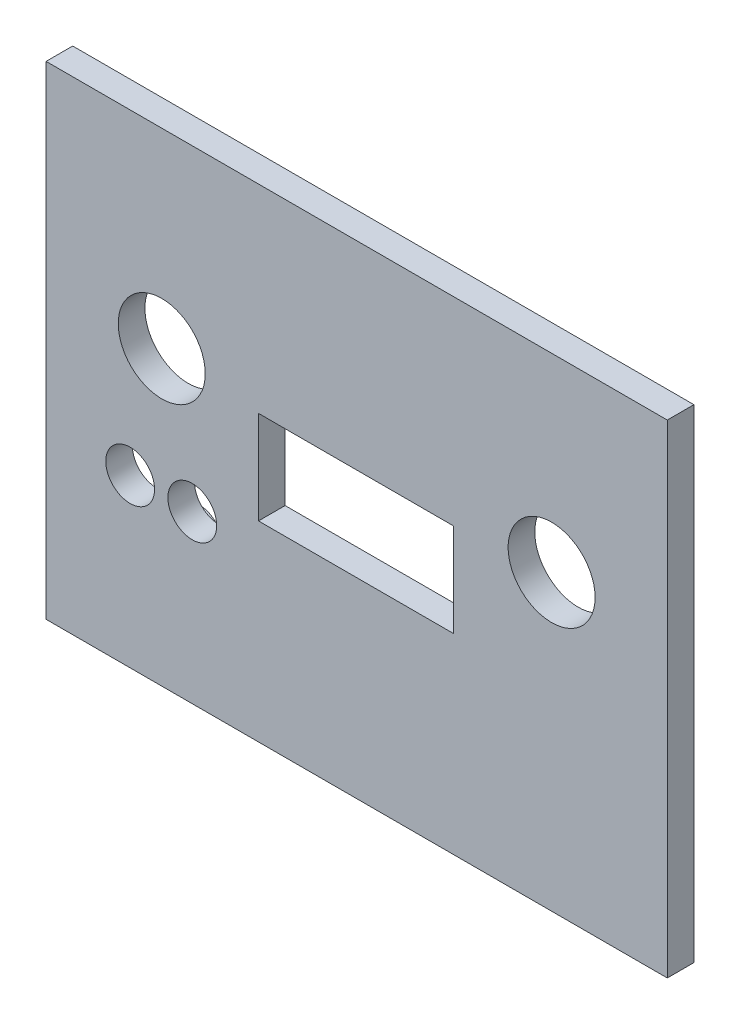
ISO-10303-21;
HEADER;
FILE_DESCRIPTION(('STEP AP214'),'2;1');
FILE_NAME('part.step','',(''),(''),'','','');
FILE_SCHEMA(('AUTOMOTIVE_DESIGN { 1 0 10303 214 1 1 1 1 }'));
ENDSEC;
DATA;
#1=APPLICATION_CONTEXT('core data for automotive mechanical design processes');
#2=APPLICATION_PROTOCOL_DEFINITION('international standard','automotive_design',2000,#1);
#3=PRODUCT_CONTEXT('',#1,'mechanical');
#4=PRODUCT('Part','Part','',(#3));
#5=PRODUCT_RELATED_PRODUCT_CATEGORY('part','',(#4));
#6=PRODUCT_DEFINITION_FORMATION('','',#4);
#7=PRODUCT_DEFINITION_CONTEXT('part definition',#1,'design');
#8=PRODUCT_DEFINITION('design','',#6,#7);
#9=PRODUCT_DEFINITION_SHAPE('','',#8);
#10=(LENGTH_UNIT() NAMED_UNIT(*) SI_UNIT(.MILLI.,.METRE.));
#11=(NAMED_UNIT(*) PLANE_ANGLE_UNIT() SI_UNIT($,.RADIAN.));
#12=(NAMED_UNIT(*) SI_UNIT($,.STERADIAN.) SOLID_ANGLE_UNIT());
#13=UNCERTAINTY_MEASURE_WITH_UNIT(LENGTH_MEASURE(1.E-05),#10,'distance_accuracy_value','');
#14=(GEOMETRIC_REPRESENTATION_CONTEXT(3) GLOBAL_UNCERTAINTY_ASSIGNED_CONTEXT((#13)) GLOBAL_UNIT_ASSIGNED_CONTEXT((#10,
#11,#12)) REPRESENTATION_CONTEXT('',''));
#15=CARTESIAN_POINT('',(0.,0.,0.));
#16=DIRECTION('',(0.,0.,1.));
#17=DIRECTION('',(1.,0.,0.));
#18=AXIS2_PLACEMENT_3D('',#15,#16,#17);
#19=CARTESIAN_POINT('',(0.,0.,0.));
#20=DIRECTION('',(0.,0.,-1.));
#21=DIRECTION('',(-1.,0.,0.));
#22=AXIS2_PLACEMENT_3D('',#19,#20,#21);
#23=PLANE('',#22);
#24=CARTESIAN_POINT('',(41.583998795927,8.16998148502236,0.));
#25=DIRECTION('',(0.,0.,-1.));
#26=DIRECTION('',(-1.,0.,0.));
#27=AXIS2_PLACEMENT_3D('',#24,#25,#26);
#28=CIRCLE('',#27,0.799999999999995);
#29=CARTESIAN_POINT('',(40.783998795927,8.16998148502236,0.));
#30=VERTEX_POINT('',#29);
#31=EDGE_CURVE('E322',#30,#30,#28,.T.);
#32=ORIENTED_EDGE('',*,*,#31,.F.);
#33=EDGE_LOOP('',(#32));
#34=FACE_BOUND('',#33,.T.);
#35=CARTESIAN_POINT('',(41.583998795927,31.9699814850224,0.));
#36=DIRECTION('',(0.,0.,-1.));
#37=DIRECTION('',(-1.,0.,0.));
#38=AXIS2_PLACEMENT_3D('',#35,#36,#37);
#39=CIRCLE('',#38,0.799999999999996);
#40=CARTESIAN_POINT('',(40.783998795927,31.9699814850224,0.));
#41=VERTEX_POINT('',#40);
#42=EDGE_CURVE('E333',#41,#41,#39,.T.);
#43=ORIENTED_EDGE('',*,*,#42,.F.);
#44=EDGE_LOOP('',(#43));
#45=FACE_BOUND('',#44,.T.);
#46=CARTESIAN_POINT('',(55.99999976,3.99999962,0.));
#47=DIRECTION('',(0.,0.,-1.));
#48=DIRECTION('',(-1.,0.,0.));
#49=AXIS2_PLACEMENT_3D('',#46,#47,#48);
#50=CIRCLE('',#49,2.5);
#51=CARTESIAN_POINT('',(53.49999976,3.99999962,0.));
#52=VERTEX_POINT('',#51);
#53=EDGE_CURVE('E367',#52,#52,#50,.T.);
#54=ORIENTED_EDGE('',*,*,#53,.F.);
#55=EDGE_LOOP('',(#54));
#56=FACE_BOUND('',#55,.T.);
#57=CARTESIAN_POINT('',(55.99999976,40.50000028,0.));
#58=DIRECTION('',(0.,0.,-1.));
#59=DIRECTION('',(-1.,0.,0.));
#60=AXIS2_PLACEMENT_3D('',#57,#58,#59);
#61=CIRCLE('',#60,2.50000000000001);
#62=CARTESIAN_POINT('',(53.49999976,40.50000028,0.));
#63=VERTEX_POINT('',#62);
#64=EDGE_CURVE('E377',#63,#63,#61,.T.);
#65=ORIENTED_EDGE('',*,*,#64,.F.);
#66=EDGE_LOOP('',(#65));
#67=FACE_BOUND('',#66,.T.);
#68=CARTESIAN_POINT('',(4.47500206028407,13.7900575489252,0.));
#69=DIRECTION('',(0.,0.,1.));
#70=DIRECTION('',(1.,0.,0.));
#71=AXIS2_PLACEMENT_3D('',#68,#69,#70);
#72=CIRCLE('',#71,2.75);
#73=CARTESIAN_POINT('',(7.22500206028407,13.7900575489252,0.));
#74=VERTEX_POINT('',#73);
#75=EDGE_CURVE('E218',#74,#74,#72,.T.);
#76=ORIENTED_EDGE('',*,*,#75,.T.);
#77=EDGE_LOOP('',(#76));
#78=FACE_BOUND('',#77,.T.);
#79=CARTESIAN_POINT('',(8.0336008016126,27.9335383003161,0.));
#80=DIRECTION('',(0.,0.,1.));
#81=DIRECTION('',(1.,0.,0.));
#82=AXIS2_PLACEMENT_3D('',#79,#80,#81);
#83=CIRCLE('',#82,4.901215244223);
#84=CARTESIAN_POINT('',(12.9348160458356,27.9335383003161,0.));
#85=VERTEX_POINT('',#84);
#86=EDGE_CURVE('E231',#85,#85,#83,.T.);
#87=ORIENTED_EDGE('',*,*,#86,.T.);
#88=EDGE_LOOP('',(#87));
#89=FACE_BOUND('',#88,.T.);
#90=DIRECTION('',(1.,0.,0.));
#91=VECTOR('',#90,1.);
#92=CARTESIAN_POINT('',(-5.00001112485931,49.4500223795584,0.));
#93=LINE('',#92,#91);
#94=CARTESIAN_POINT('',(-5.00001112485931,49.4500223795584,0.));
#95=VERTEX_POINT('',#94);
#96=CARTESIAN_POINT('',(65.,49.4500223795584,0.));
#97=VERTEX_POINT('',#96);
#98=EDGE_CURVE('E237',#95,#97,#93,.T.);
#99=ORIENTED_EDGE('',*,*,#98,.T.);
#100=DIRECTION('',(0.,-1.,0.));
#101=VECTOR('',#100,1.);
#102=CARTESIAN_POINT('',(65.,49.4500223795584,0.));
#103=LINE('',#102,#101);
#104=CARTESIAN_POINT('',(65.,-5.0000216666664,0.));
#105=VERTEX_POINT('',#104);
#106=EDGE_CURVE('E253',#97,#105,#103,.T.);
#107=ORIENTED_EDGE('',*,*,#106,.T.);
#108=DIRECTION('',(1.,0.,0.));
#109=VECTOR('',#108,1.);
#110=CARTESIAN_POINT('',(-5.00001112485931,-5.0000216666664,0.));
#111=LINE('',#110,#109);
#112=CARTESIAN_POINT('',(-5.00001112485931,-5.0000216666664,0.));
#113=VERTEX_POINT('',#112);
#114=EDGE_CURVE('E256',#113,#105,#111,.T.);
#115=ORIENTED_EDGE('',*,*,#114,.F.);
#116=DIRECTION('',(0.,-1.,0.));
#117=VECTOR('',#116,1.);
#118=CARTESIAN_POINT('',(-5.00001112485931,49.4500223795584,0.));
#119=LINE('',#118,#117);
#120=EDGE_CURVE('E244',#95,#113,#119,.T.);
#121=ORIENTED_EDGE('',*,*,#120,.F.);
#122=EDGE_LOOP('',(#99,#107,#115,#121));
#123=FACE_BOUND('',#122,.T.);
#124=CARTESIAN_POINT('',(51.9663990756539,28.0664616620789,0.));
#125=DIRECTION('',(0.,0.,1.));
#126=DIRECTION('',(1.,0.,0.));
#127=AXIS2_PLACEMENT_3D('',#124,#125,#126);
#128=CIRCLE('',#127,4.90121524422299);
#129=CARTESIAN_POINT('',(56.8676143198769,28.0664616620789,0.));
#130=VERTEX_POINT('',#129);
#131=EDGE_CURVE('E225',#130,#130,#128,.T.);
#132=ORIENTED_EDGE('',*,*,#131,.T.);
#133=EDGE_LOOP('',(#132));
#134=FACE_BOUND('',#133,.T.);
#135=DIRECTION('',(1.,0.,0.));
#136=VECTOR('',#135,1.);
#137=CARTESIAN_POINT('',(18.933998795927,27.0699814850224,0.));
#138=LINE('',#137,#136);
#139=CARTESIAN_POINT('',(18.933998795927,27.0699814850224,0.));
#140=VERTEX_POINT('',#139);
#141=CARTESIAN_POINT('',(40.933998795927,27.0699814850224,0.));
#142=VERTEX_POINT('',#141);
#143=EDGE_CURVE('E142',#140,#142,#138,.T.);
#144=ORIENTED_EDGE('',*,*,#143,.F.);
#145=DIRECTION('',(0.,-1.,0.));
#146=VECTOR('',#145,1.);
#147=CARTESIAN_POINT('',(18.933998795927,27.0699814850224,0.));
#148=LINE('',#147,#146);
#149=CARTESIAN_POINT('',(18.933998795927,16.5699814850224,0.));
#150=VERTEX_POINT('',#149);
#151=EDGE_CURVE('E199',#140,#150,#148,.T.);
#152=ORIENTED_EDGE('',*,*,#151,.T.);
#153=DIRECTION('',(1.,0.,0.));
#154=VECTOR('',#153,1.);
#155=CARTESIAN_POINT('',(18.933998795927,16.5699814850224,0.));
#156=LINE('',#155,#154);
#157=CARTESIAN_POINT('',(40.933998795927,16.5699814850224,0.));
#158=VERTEX_POINT('',#157);
#159=EDGE_CURVE('E202',#150,#158,#156,.T.);
#160=ORIENTED_EDGE('',*,*,#159,.T.);
#161=DIRECTION('',(0.,-1.,0.));
#162=VECTOR('',#161,1.);
#163=CARTESIAN_POINT('',(40.933998795927,27.0699814850224,0.));
#164=LINE('',#163,#162);
#165=EDGE_CURVE('E211',#142,#158,#164,.T.);
#166=ORIENTED_EDGE('',*,*,#165,.F.);
#167=EDGE_LOOP('',(#144,#152,#160,#166));
#168=FACE_BOUND('',#167,.T.);
#169=CARTESIAN_POINT('',(11.4750211337711,13.7500375599113,0.));
#170=DIRECTION('',(0.,0.,1.));
#171=DIRECTION('',(1.,0.,0.));
#172=AXIS2_PLACEMENT_3D('',#169,#170,#171);
#173=CIRCLE('',#172,2.75);
#174=CARTESIAN_POINT('',(14.2250211337711,13.7500375599113,0.));
#175=VERTEX_POINT('',#174);
#176=EDGE_CURVE('E205',#175,#175,#173,.T.);
#177=ORIENTED_EDGE('',*,*,#176,.T.);
#178=EDGE_LOOP('',(#177));
#179=FACE_BOUND('',#178,.T.);
#180=CARTESIAN_POINT('',(3.99999962,40.50000028,0.));
#181=DIRECTION('',(0.,0.,-1.));
#182=DIRECTION('',(-1.,0.,0.));
#183=AXIS2_PLACEMENT_3D('',#180,#181,#182);
#184=CIRCLE('',#183,2.5);
#185=CARTESIAN_POINT('',(1.49999962,40.50000028,0.));
#186=VERTEX_POINT('',#185);
#187=EDGE_CURVE('E306',#186,#186,#184,.T.);
#188=ORIENTED_EDGE('',*,*,#187,.F.);
#189=EDGE_LOOP('',(#188));
#190=FACE_BOUND('',#189,.T.);
#191=CARTESIAN_POINT('',(3.99999962,3.99999962,0.));
#192=DIRECTION('',(0.,0.,-1.));
#193=DIRECTION('',(-1.,0.,0.));
#194=AXIS2_PLACEMENT_3D('',#191,#192,#193);
#195=CIRCLE('',#194,2.5);
#196=CARTESIAN_POINT('',(1.49999962,3.99999962,0.));
#197=VERTEX_POINT('',#196);
#198=EDGE_CURVE('E310',#197,#197,#195,.T.);
#199=ORIENTED_EDGE('',*,*,#198,.F.);
#200=EDGE_LOOP('',(#199));
#201=FACE_BOUND('',#200,.T.);
#202=CARTESIAN_POINT('',(18.283998795927,31.9699814850224,0.));
#203=DIRECTION('',(0.,0.,-1.));
#204=DIRECTION('',(-1.,0.,0.));
#205=AXIS2_PLACEMENT_3D('',#202,#203,#204);
#206=CIRCLE('',#205,0.800000000000003);
#207=CARTESIAN_POINT('',(17.483998795927,31.9699814850224,0.));
#208=VERTEX_POINT('',#207);
#209=EDGE_CURVE('E314',#208,#208,#206,.T.);
#210=ORIENTED_EDGE('',*,*,#209,.F.);
#211=EDGE_LOOP('',(#210));
#212=FACE_BOUND('',#211,.T.);
#213=CARTESIAN_POINT('',(18.283998795927,8.16998148502237,0.));
#214=DIRECTION('',(0.,0.,-1.));
#215=DIRECTION('',(-1.,0.,0.));
#216=AXIS2_PLACEMENT_3D('',#213,#214,#215);
#217=CIRCLE('',#216,0.800000000000006);
#218=CARTESIAN_POINT('',(17.483998795927,8.16998148502237,0.));
#219=VERTEX_POINT('',#218);
#220=EDGE_CURVE('E317',#219,#219,#217,.T.);
#221=ORIENTED_EDGE('',*,*,#220,.F.);
#222=EDGE_LOOP('',(#221));
#223=FACE_BOUND('',#222,.T.);
#224=ADVANCED_FACE('F117',(#34,#45,#56,#67,#78,#89,#123,#134,#168,#179,#190,#201,#212,#223),#23,.T.);
#225=CARTESIAN_POINT('',(0.,0.,3.));
#226=DIRECTION('',(0.,0.,-1.));
#227=DIRECTION('',(-1.,0.,0.));
#228=AXIS2_PLACEMENT_3D('',#225,#226,#227);
#229=PLANE('',#228);
#230=CARTESIAN_POINT('',(4.47500206028407,13.7900575489252,3.));
#231=DIRECTION('',(0.,0.,1.));
#232=DIRECTION('',(1.,0.,0.));
#233=AXIS2_PLACEMENT_3D('',#230,#231,#232);
#234=CIRCLE('',#233,2.75);
#235=CARTESIAN_POINT('',(7.22500206028407,13.7900575489252,3.));
#236=VERTEX_POINT('',#235);
#237=EDGE_CURVE('E222',#236,#236,#234,.T.);
#238=ORIENTED_EDGE('',*,*,#237,.F.);
#239=EDGE_LOOP('',(#238));
#240=FACE_BOUND('',#239,.T.);
#241=CARTESIAN_POINT('',(8.0336008016126,27.9335383003161,3.));
#242=DIRECTION('',(0.,0.,1.));
#243=DIRECTION('',(1.,0.,0.));
#244=AXIS2_PLACEMENT_3D('',#241,#242,#243);
#245=CIRCLE('',#244,4.901215244223);
#246=CARTESIAN_POINT('',(12.9348160458356,27.9335383003161,3.));
#247=VERTEX_POINT('',#246);
#248=EDGE_CURVE('E234',#247,#247,#245,.T.);
#249=ORIENTED_EDGE('',*,*,#248,.F.);
#250=EDGE_LOOP('',(#249));
#251=FACE_BOUND('',#250,.T.);
#252=DIRECTION('',(1.,0.,0.));
#253=VECTOR('',#252,1.);
#254=CARTESIAN_POINT('',(-5.00001112485931,49.4500223795584,3.));
#255=LINE('',#254,#253);
#256=CARTESIAN_POINT('',(-5.00001112485931,49.4500223795584,3.));
#257=VERTEX_POINT('',#256);
#258=CARTESIAN_POINT('',(65.,49.4500223795584,3.));
#259=VERTEX_POINT('',#258);
#260=EDGE_CURVE('E240',#257,#259,#255,.T.);
#261=ORIENTED_EDGE('',*,*,#260,.F.);
#262=DIRECTION('',(0.,-1.,0.));
#263=VECTOR('',#262,1.);
#264=CARTESIAN_POINT('',(-5.00001112485931,49.4500223795584,3.));
#265=LINE('',#264,#263);
#266=CARTESIAN_POINT('',(-5.00001112485931,-5.0000216666664,3.));
#267=VERTEX_POINT('',#266);
#268=EDGE_CURVE('E249',#257,#267,#265,.T.);
#269=ORIENTED_EDGE('',*,*,#268,.T.);
#270=DIRECTION('',(1.,0.,0.));
#271=VECTOR('',#270,1.);
#272=CARTESIAN_POINT('',(-5.00001112485931,-5.0000216666664,3.));
#273=LINE('',#272,#271);
#274=CARTESIAN_POINT('',(65.,-5.0000216666664,3.));
#275=VERTEX_POINT('',#274);
#276=EDGE_CURVE('E247',#267,#275,#273,.T.);
#277=ORIENTED_EDGE('',*,*,#276,.T.);
#278=DIRECTION('',(0.,-1.,0.));
#279=VECTOR('',#278,1.);
#280=CARTESIAN_POINT('',(65.,49.4500223795584,3.));
#281=LINE('',#280,#279);
#282=EDGE_CURVE('E243',#259,#275,#281,.T.);
#283=ORIENTED_EDGE('',*,*,#282,.F.);
#284=EDGE_LOOP('',(#261,#269,#277,#283));
#285=FACE_BOUND('',#284,.T.);
#286=CARTESIAN_POINT('',(51.9663990756539,28.0664616620789,3.));
#287=DIRECTION('',(0.,0.,1.));
#288=DIRECTION('',(1.,0.,0.));
#289=AXIS2_PLACEMENT_3D('',#286,#287,#288);
#290=CIRCLE('',#289,4.90121524422299);
#291=CARTESIAN_POINT('',(56.8676143198769,28.0664616620789,3.));
#292=VERTEX_POINT('',#291);
#293=EDGE_CURVE('E228',#292,#292,#290,.T.);
#294=ORIENTED_EDGE('',*,*,#293,.F.);
#295=EDGE_LOOP('',(#294));
#296=FACE_BOUND('',#295,.T.);
#297=DIRECTION('',(0.,-1.,0.));
#298=VECTOR('',#297,1.);
#299=CARTESIAN_POINT('',(18.933998795927,27.0699814850224,3.));
#300=LINE('',#299,#298);
#301=CARTESIAN_POINT('',(18.933998795927,27.0699814850224,3.));
#302=VERTEX_POINT('',#301);
#303=CARTESIAN_POINT('',(18.933998795927,16.5699814850224,3.));
#304=VERTEX_POINT('',#303);
#305=EDGE_CURVE('E188',#302,#304,#300,.T.);
#306=ORIENTED_EDGE('',*,*,#305,.F.);
#307=DIRECTION('',(1.,0.,0.));
#308=VECTOR('',#307,1.);
#309=CARTESIAN_POINT('',(18.933998795927,27.0699814850224,3.));
#310=LINE('',#309,#308);
#311=CARTESIAN_POINT('',(40.933998795927,27.0699814850224,3.));
#312=VERTEX_POINT('',#311);
#313=EDGE_CURVE('E185',#302,#312,#310,.T.);
#314=ORIENTED_EDGE('',*,*,#313,.T.);
#315=DIRECTION('',(0.,-1.,0.));
#316=VECTOR('',#315,1.);
#317=CARTESIAN_POINT('',(40.933998795927,27.0699814850224,3.));
#318=LINE('',#317,#316);
#319=CARTESIAN_POINT('',(40.933998795927,16.5699814850224,3.));
#320=VERTEX_POINT('',#319);
#321=EDGE_CURVE('E191',#312,#320,#318,.T.);
#322=ORIENTED_EDGE('',*,*,#321,.T.);
#323=DIRECTION('',(1.,0.,0.));
#324=VECTOR('',#323,1.);
#325=CARTESIAN_POINT('',(18.933998795927,16.5699814850224,3.));
#326=LINE('',#325,#324);
#327=EDGE_CURVE('E195',#304,#320,#326,.T.);
#328=ORIENTED_EDGE('',*,*,#327,.F.);
#329=EDGE_LOOP('',(#306,#314,#322,#328));
#330=FACE_BOUND('',#329,.T.);
#331=CARTESIAN_POINT('',(11.4750211337711,13.7500375599113,3.));
#332=DIRECTION('',(0.,0.,1.));
#333=DIRECTION('',(1.,0.,0.));
#334=AXIS2_PLACEMENT_3D('',#331,#332,#333);
#335=CIRCLE('',#334,2.75);
#336=CARTESIAN_POINT('',(14.2250211337711,13.7500375599113,3.));
#337=VERTEX_POINT('',#336);
#338=EDGE_CURVE('E212',#337,#337,#335,.T.);
#339=ORIENTED_EDGE('',*,*,#338,.F.);
#340=EDGE_LOOP('',(#339));
#341=FACE_BOUND('',#340,.T.);
#342=ADVANCED_FACE('F197',(#240,#251,#285,#296,#330,#341),#229,.F.);
#343=CARTESIAN_POINT('',(-5.00001112485931,49.4500223795584,3.));
#344=DIRECTION('',(0.,1.,0.));
#345=DIRECTION('',(0.,0.,1.));
#346=AXIS2_PLACEMENT_3D('',#343,#344,#345);
#347=PLANE('',#346);
#348=ORIENTED_EDGE('',*,*,#98,.F.);
#349=DIRECTION('',(0.,0.,-1.));
#350=VECTOR('',#349,1.);
#351=CARTESIAN_POINT('',(-5.00001112485931,49.4500223795584,3.));
#352=LINE('',#351,#350);
#353=EDGE_CURVE('E12',#257,#95,#352,.T.);
#354=ORIENTED_EDGE('',*,*,#353,.F.);
#355=ORIENTED_EDGE('',*,*,#260,.T.);
#356=DIRECTION('',(0.,0.,-1.));
#357=VECTOR('',#356,1.);
#358=CARTESIAN_POINT('',(65.,49.4500223795584,3.));
#359=LINE('',#358,#357);
#360=EDGE_CURVE('E121',#259,#97,#359,.T.);
#361=ORIENTED_EDGE('',*,*,#360,.T.);
#362=EDGE_LOOP('',(#348,#354,#355,#361));
#363=FACE_BOUND('',#362,.T.);
#364=ADVANCED_FACE('F119',(#363),#347,.T.);
#365=CARTESIAN_POINT('',(-5.00001112485931,49.4500223795584,3.));
#366=DIRECTION('',(1.,0.,0.));
#367=DIRECTION('',(0.,0.,-1.));
#368=AXIS2_PLACEMENT_3D('',#365,#366,#367);
#369=PLANE('',#368);
#370=ORIENTED_EDGE('',*,*,#120,.T.);
#371=DIRECTION('',(0.,0.,-1.));
#372=VECTOR('',#371,1.);
#373=CARTESIAN_POINT('',(-5.00001112485931,-5.0000216666664,3.));
#374=LINE('',#373,#372);
#375=EDGE_CURVE('E126',#267,#113,#374,.T.);
#376=ORIENTED_EDGE('',*,*,#375,.F.);
#377=ORIENTED_EDGE('',*,*,#268,.F.);
#378=ORIENTED_EDGE('',*,*,#353,.T.);
#379=EDGE_LOOP('',(#370,#376,#377,#378));
#380=FACE_BOUND('',#379,.T.);
#381=ADVANCED_FACE('F276',(#380),#369,.F.);
#382=CARTESIAN_POINT('',(-5.00001112485931,-5.0000216666664,3.));
#383=DIRECTION('',(0.,1.,0.));
#384=DIRECTION('',(0.,0.,1.));
#385=AXIS2_PLACEMENT_3D('',#382,#383,#384);
#386=PLANE('',#385);
#387=ORIENTED_EDGE('',*,*,#114,.T.);
#388=DIRECTION('',(0.,0.,-1.));
#389=VECTOR('',#388,1.);
#390=CARTESIAN_POINT('',(65.,-5.0000216666664,3.));
#391=LINE('',#390,#389);
#392=EDGE_CURVE('E261',#275,#105,#391,.T.);
#393=ORIENTED_EDGE('',*,*,#392,.F.);
#394=ORIENTED_EDGE('',*,*,#276,.F.);
#395=ORIENTED_EDGE('',*,*,#375,.T.);
#396=EDGE_LOOP('',(#387,#393,#394,#395));
#397=FACE_BOUND('',#396,.T.);
#398=ADVANCED_FACE('F280',(#397),#386,.F.);
#399=CARTESIAN_POINT('',(65.,49.4500223795584,3.));
#400=DIRECTION('',(1.,0.,0.));
#401=DIRECTION('',(0.,0.,-1.));
#402=AXIS2_PLACEMENT_3D('',#399,#400,#401);
#403=PLANE('',#402);
#404=ORIENTED_EDGE('',*,*,#106,.F.);
#405=ORIENTED_EDGE('',*,*,#360,.F.);
#406=ORIENTED_EDGE('',*,*,#282,.T.);
#407=ORIENTED_EDGE('',*,*,#392,.T.);
#408=EDGE_LOOP('',(#404,#405,#406,#407));
#409=FACE_BOUND('',#408,.T.);
#410=ADVANCED_FACE('F269',(#409),#403,.T.);
#411=CARTESIAN_POINT('',(8.0336008016126,27.9335383003161,3.));
#412=DIRECTION('',(0.,0.,-1.));
#413=DIRECTION('',(-1.,0.,0.));
#414=AXIS2_PLACEMENT_3D('',#411,#412,#413);
#415=CYLINDRICAL_SURFACE('',#414,4.901215244223);
#416=ORIENTED_EDGE('',*,*,#248,.T.);
#417=EDGE_LOOP('',(#416));
#418=FACE_BOUND('',#417,.T.);
#419=ORIENTED_EDGE('',*,*,#86,.F.);
#420=EDGE_LOOP('',(#419));
#421=FACE_BOUND('',#420,.T.);
#422=ADVANCED_FACE('F292',(#418,#421),#415,.F.);
#423=CARTESIAN_POINT('',(51.9663990756539,28.0664616620789,3.));
#424=DIRECTION('',(0.,0.,-1.));
#425=DIRECTION('',(-1.,0.,0.));
#426=AXIS2_PLACEMENT_3D('',#423,#424,#425);
#427=CYLINDRICAL_SURFACE('',#426,4.90121524422299);
#428=ORIENTED_EDGE('',*,*,#293,.T.);
#429=EDGE_LOOP('',(#428));
#430=FACE_BOUND('',#429,.T.);
#431=ORIENTED_EDGE('',*,*,#131,.F.);
#432=EDGE_LOOP('',(#431));
#433=FACE_BOUND('',#432,.T.);
#434=ADVANCED_FACE('F288',(#430,#433),#427,.F.);
#435=CARTESIAN_POINT('',(4.47500206028407,13.7900575489252,3.));
#436=DIRECTION('',(0.,0.,-1.));
#437=DIRECTION('',(-1.,0.,0.));
#438=AXIS2_PLACEMENT_3D('',#435,#436,#437);
#439=CYLINDRICAL_SURFACE('',#438,2.75);
#440=ORIENTED_EDGE('',*,*,#237,.T.);
#441=EDGE_LOOP('',(#440));
#442=FACE_BOUND('',#441,.T.);
#443=ORIENTED_EDGE('',*,*,#75,.F.);
#444=EDGE_LOOP('',(#443));
#445=FACE_BOUND('',#444,.T.);
#446=ADVANCED_FACE('F291',(#442,#445),#439,.F.);
#447=CARTESIAN_POINT('',(18.933998795927,27.0699814850224,3.));
#448=DIRECTION('',(0.,1.,0.));
#449=DIRECTION('',(0.,0.,1.));
#450=AXIS2_PLACEMENT_3D('',#447,#448,#449);
#451=PLANE('',#450);
#452=ORIENTED_EDGE('',*,*,#143,.T.);
#453=DIRECTION('',(0.,0.,-1.));
#454=VECTOR('',#453,1.);
#455=CARTESIAN_POINT('',(40.933998795927,27.0699814850224,3.));
#456=LINE('',#455,#454);
#457=EDGE_CURVE('E182',#312,#142,#456,.T.);
#458=ORIENTED_EDGE('',*,*,#457,.F.);
#459=ORIENTED_EDGE('',*,*,#313,.F.);
#460=DIRECTION('',(0.,0.,-1.));
#461=VECTOR('',#460,1.);
#462=CARTESIAN_POINT('',(18.933998795927,27.0699814850224,3.));
#463=LINE('',#462,#461);
#464=EDGE_CURVE('E216',#302,#140,#463,.T.);
#465=ORIENTED_EDGE('',*,*,#464,.T.);
#466=EDGE_LOOP('',(#452,#458,#459,#465));
#467=FACE_BOUND('',#466,.T.);
#468=ADVANCED_FACE('F183',(#467),#451,.F.);
#469=CARTESIAN_POINT('',(18.933998795927,27.0699814850224,3.));
#470=DIRECTION('',(1.,0.,0.));
#471=DIRECTION('',(0.,0.,-1.));
#472=AXIS2_PLACEMENT_3D('',#469,#470,#471);
#473=PLANE('',#472);
#474=ORIENTED_EDGE('',*,*,#151,.F.);
#475=ORIENTED_EDGE('',*,*,#464,.F.);
#476=ORIENTED_EDGE('',*,*,#305,.T.);
#477=DIRECTION('',(0.,0.,-1.));
#478=VECTOR('',#477,1.);
#479=CARTESIAN_POINT('',(18.933998795927,16.5699814850224,3.));
#480=LINE('',#479,#478);
#481=EDGE_CURVE('E219',#304,#150,#480,.T.);
#482=ORIENTED_EDGE('',*,*,#481,.T.);
#483=EDGE_LOOP('',(#474,#475,#476,#482));
#484=FACE_BOUND('',#483,.T.);
#485=ADVANCED_FACE('F402',(#484),#473,.T.);
#486=CARTESIAN_POINT('',(18.933998795927,16.5699814850224,3.));
#487=DIRECTION('',(0.,1.,0.));
#488=DIRECTION('',(0.,0.,1.));
#489=AXIS2_PLACEMENT_3D('',#486,#487,#488);
#490=PLANE('',#489);
#491=ORIENTED_EDGE('',*,*,#159,.F.);
#492=ORIENTED_EDGE('',*,*,#481,.F.);
#493=ORIENTED_EDGE('',*,*,#327,.T.);
#494=DIRECTION('',(0.,0.,-1.));
#495=VECTOR('',#494,1.);
#496=CARTESIAN_POINT('',(40.933998795927,16.5699814850224,3.));
#497=LINE('',#496,#495);
#498=EDGE_CURVE('E134',#320,#158,#497,.T.);
#499=ORIENTED_EDGE('',*,*,#498,.T.);
#500=EDGE_LOOP('',(#491,#492,#493,#499));
#501=FACE_BOUND('',#500,.T.);
#502=ADVANCED_FACE('F398',(#501),#490,.T.);
#503=CARTESIAN_POINT('',(40.933998795927,27.0699814850224,3.));
#504=DIRECTION('',(1.,0.,0.));
#505=DIRECTION('',(0.,0.,-1.));
#506=AXIS2_PLACEMENT_3D('',#503,#504,#505);
#507=PLANE('',#506);
#508=ORIENTED_EDGE('',*,*,#165,.T.);
#509=ORIENTED_EDGE('',*,*,#498,.F.);
#510=ORIENTED_EDGE('',*,*,#321,.F.);
#511=ORIENTED_EDGE('',*,*,#457,.T.);
#512=EDGE_LOOP('',(#508,#509,#510,#511));
#513=FACE_BOUND('',#512,.T.);
#514=ADVANCED_FACE('F192',(#513),#507,.F.);
#515=CARTESIAN_POINT('',(11.4750211337711,13.7500375599113,3.));
#516=DIRECTION('',(0.,0.,-1.));
#517=DIRECTION('',(-1.,0.,0.));
#518=AXIS2_PLACEMENT_3D('',#515,#516,#517);
#519=CYLINDRICAL_SURFACE('',#518,2.75);
#520=ORIENTED_EDGE('',*,*,#338,.T.);
#521=EDGE_LOOP('',(#520));
#522=FACE_BOUND('',#521,.T.);
#523=ORIENTED_EDGE('',*,*,#176,.F.);
#524=EDGE_LOOP('',(#523));
#525=FACE_BOUND('',#524,.T.);
#526=ADVANCED_FACE('F386',(#522,#525),#519,.F.);
#527=CARTESIAN_POINT('',(55.99999976,40.50000028,-5.3));
#528=DIRECTION('',(0.,0.,1.));
#529=DIRECTION('',(1.,0.,0.));
#530=AXIS2_PLACEMENT_3D('',#527,#528,#529);
#531=CYLINDRICAL_SURFACE('',#530,2.50000000000001);
#532=CARTESIAN_POINT('',(55.99999976,40.50000028,-5.3));
#533=DIRECTION('',(0.,0.,-1.));
#534=DIRECTION('',(-1.,0.,0.));
#535=AXIS2_PLACEMENT_3D('',#532,#533,#534);
#536=CIRCLE('',#535,2.50000000000001);
#537=CARTESIAN_POINT('',(53.49999976,40.50000028,-5.3));
#538=VERTEX_POINT('',#537);
#539=EDGE_CURVE('E379',#538,#538,#536,.T.);
#540=ORIENTED_EDGE('',*,*,#539,.F.);
#541=EDGE_LOOP('',(#540));
#542=FACE_BOUND('',#541,.T.);
#543=ORIENTED_EDGE('',*,*,#64,.T.);
#544=EDGE_LOOP('',(#543));
#545=FACE_BOUND('',#544,.T.);
#546=ADVANCED_FACE('F389',(#542,#545),#531,.T.);
#547=CARTESIAN_POINT('',(55.99999976,40.50000028,-5.3));
#548=DIRECTION('',(0.,0.,-1.));
#549=DIRECTION('',(-1.,0.,0.));
#550=AXIS2_PLACEMENT_3D('',#547,#548,#549);
#551=PLANE('',#550);
#552=CARTESIAN_POINT('',(55.99999976,40.50000028,-5.3));
#553=DIRECTION('',(0.,0.,-1.));
#554=DIRECTION('',(-1.,0.,0.));
#555=AXIS2_PLACEMENT_3D('',#552,#553,#554);
#556=CIRCLE('',#555,1.25);
#557=CARTESIAN_POINT('',(54.74999976,40.50000028,-5.3));
#558=VERTEX_POINT('',#557);
#559=EDGE_CURVE('E356',#558,#558,#556,.T.);
#560=ORIENTED_EDGE('',*,*,#559,.F.);
#561=EDGE_LOOP('',(#560));
#562=FACE_BOUND('',#561,.T.);
#563=ORIENTED_EDGE('',*,*,#539,.T.);
#564=EDGE_LOOP('',(#563));
#565=FACE_BOUND('',#564,.T.);
#566=ADVANCED_FACE('F395',(#562,#565),#551,.T.);
#567=CARTESIAN_POINT('',(3.99999962,40.50000028,-5.3));
#568=DIRECTION('',(0.,0.,1.));
#569=DIRECTION('',(1.,0.,0.));
#570=AXIS2_PLACEMENT_3D('',#567,#568,#569);
#571=CYLINDRICAL_SURFACE('',#570,2.5);
#572=CARTESIAN_POINT('',(3.99999962,40.50000028,-5.3));
#573=DIRECTION('',(0.,0.,-1.));
#574=DIRECTION('',(-1.,0.,0.));
#575=AXIS2_PLACEMENT_3D('',#572,#573,#574);
#576=CIRCLE('',#575,2.5);
#577=CARTESIAN_POINT('',(1.49999962,40.50000028,-5.3));
#578=VERTEX_POINT('',#577);
#579=EDGE_CURVE('E374',#578,#578,#576,.T.);
#580=ORIENTED_EDGE('',*,*,#579,.F.);
#581=EDGE_LOOP('',(#580));
#582=FACE_BOUND('',#581,.T.);
#583=ORIENTED_EDGE('',*,*,#187,.T.);
#584=EDGE_LOOP('',(#583));
#585=FACE_BOUND('',#584,.T.);
#586=ADVANCED_FACE('F470',(#582,#585),#571,.T.);
#587=CARTESIAN_POINT('',(3.99999962,40.50000028,-5.3));
#588=DIRECTION('',(0.,0.,-1.));
#589=DIRECTION('',(-1.,0.,0.));
#590=AXIS2_PLACEMENT_3D('',#587,#588,#589);
#591=PLANE('',#590);
#592=CARTESIAN_POINT('',(3.99999962,40.50000028,-5.3));
#593=DIRECTION('',(0.,0.,-1.));
#594=DIRECTION('',(-1.,0.,0.));
#595=AXIS2_PLACEMENT_3D('',#592,#593,#594);
#596=CIRCLE('',#595,1.25);
#597=CARTESIAN_POINT('',(2.74999962,40.50000028,-5.3));
#598=VERTEX_POINT('',#597);
#599=EDGE_CURVE('E350',#598,#598,#596,.T.);
#600=ORIENTED_EDGE('',*,*,#599,.F.);
#601=EDGE_LOOP('',(#600));
#602=FACE_BOUND('',#601,.T.);
#603=ORIENTED_EDGE('',*,*,#579,.T.);
#604=EDGE_LOOP('',(#603));
#605=FACE_BOUND('',#604,.T.);
#606=ADVANCED_FACE('F475',(#602,#605),#591,.T.);
#607=CARTESIAN_POINT('',(55.99999976,3.99999962,-5.3));
#608=DIRECTION('',(0.,0.,1.));
#609=DIRECTION('',(1.,0.,0.));
#610=AXIS2_PLACEMENT_3D('',#607,#608,#609);
#611=CYLINDRICAL_SURFACE('',#610,2.5);
#612=CARTESIAN_POINT('',(55.99999976,3.99999962,-5.3));
#613=DIRECTION('',(0.,0.,-1.));
#614=DIRECTION('',(-1.,0.,0.));
#615=AXIS2_PLACEMENT_3D('',#612,#613,#614);
#616=CIRCLE('',#615,2.5);
#617=CARTESIAN_POINT('',(53.49999976,3.99999962,-5.3));
#618=VERTEX_POINT('',#617);
#619=EDGE_CURVE('E369',#618,#618,#616,.T.);
#620=ORIENTED_EDGE('',*,*,#619,.F.);
#621=EDGE_LOOP('',(#620));
#622=FACE_BOUND('',#621,.T.);
#623=ORIENTED_EDGE('',*,*,#53,.T.);
#624=EDGE_LOOP('',(#623));
#625=FACE_BOUND('',#624,.T.);
#626=ADVANCED_FACE('F483',(#622,#625),#611,.T.);
#627=CARTESIAN_POINT('',(55.99999976,3.99999962,-5.3));
#628=DIRECTION('',(0.,0.,-1.));
#629=DIRECTION('',(-1.,0.,0.));
#630=AXIS2_PLACEMENT_3D('',#627,#628,#629);
#631=PLANE('',#630);
#632=CARTESIAN_POINT('',(55.99999976,3.99999962,-5.3));
#633=DIRECTION('',(0.,0.,-1.));
#634=DIRECTION('',(-1.,0.,0.));
#635=AXIS2_PLACEMENT_3D('',#632,#633,#634);
#636=CIRCLE('',#635,1.25);
#637=CARTESIAN_POINT('',(54.74999976,3.99999962,-5.3));
#638=VERTEX_POINT('',#637);
#639=EDGE_CURVE('E344',#638,#638,#636,.T.);
#640=ORIENTED_EDGE('',*,*,#639,.F.);
#641=EDGE_LOOP('',(#640));
#642=FACE_BOUND('',#641,.T.);
#643=ORIENTED_EDGE('',*,*,#619,.T.);
#644=EDGE_LOOP('',(#643));
#645=FACE_BOUND('',#644,.T.);
#646=ADVANCED_FACE('F488',(#642,#645),#631,.T.);
#647=CARTESIAN_POINT('',(3.99999962,3.99999962,-5.3));
#648=DIRECTION('',(0.,0.,1.));
#649=DIRECTION('',(1.,0.,0.));
#650=AXIS2_PLACEMENT_3D('',#647,#648,#649);
#651=CYLINDRICAL_SURFACE('',#650,2.5);
#652=CARTESIAN_POINT('',(3.99999962,3.99999962,-5.3));
#653=DIRECTION('',(0.,0.,-1.));
#654=DIRECTION('',(-1.,0.,0.));
#655=AXIS2_PLACEMENT_3D('',#652,#653,#654);
#656=CIRCLE('',#655,2.5);
#657=CARTESIAN_POINT('',(1.49999962,3.99999962,-5.3));
#658=VERTEX_POINT('',#657);
#659=EDGE_CURVE('E364',#658,#658,#656,.T.);
#660=ORIENTED_EDGE('',*,*,#659,.F.);
#661=EDGE_LOOP('',(#660));
#662=FACE_BOUND('',#661,.T.);
#663=ORIENTED_EDGE('',*,*,#198,.T.);
#664=EDGE_LOOP('',(#663));
#665=FACE_BOUND('',#664,.T.);
#666=ADVANCED_FACE('F496',(#662,#665),#651,.T.);
#667=CARTESIAN_POINT('',(3.99999962,3.99999962,-5.3));
#668=DIRECTION('',(0.,0.,-1.));
#669=DIRECTION('',(-1.,0.,0.));
#670=AXIS2_PLACEMENT_3D('',#667,#668,#669);
#671=PLANE('',#670);
#672=CARTESIAN_POINT('',(3.99999962,3.99999962,-5.3));
#673=DIRECTION('',(0.,0.,-1.));
#674=DIRECTION('',(-1.,0.,0.));
#675=AXIS2_PLACEMENT_3D('',#672,#673,#674);
#676=CIRCLE('',#675,1.25);
#677=CARTESIAN_POINT('',(2.74999962,3.99999962,-5.3));
#678=VERTEX_POINT('',#677);
#679=EDGE_CURVE('E338',#678,#678,#676,.T.);
#680=ORIENTED_EDGE('',*,*,#679,.F.);
#681=EDGE_LOOP('',(#680));
#682=FACE_BOUND('',#681,.T.);
#683=ORIENTED_EDGE('',*,*,#659,.T.);
#684=EDGE_LOOP('',(#683));
#685=FACE_BOUND('',#684,.T.);
#686=ADVANCED_FACE('F501',(#682,#685),#671,.T.);
#687=CARTESIAN_POINT('',(55.99999976,40.50000028,-0.3));
#688=DIRECTION('',(0.,0.,-1.));
#689=DIRECTION('',(-1.,0.,0.));
#690=AXIS2_PLACEMENT_3D('',#687,#688,#689);
#691=CYLINDRICAL_SURFACE('',#690,1.25);
#692=CARTESIAN_POINT('',(55.99999976,40.50000028,-0.3));
#693=DIRECTION('',(0.,0.,-1.));
#694=DIRECTION('',(-1.,0.,0.));
#695=AXIS2_PLACEMENT_3D('',#692,#693,#694);
#696=CIRCLE('',#695,1.25);
#697=CARTESIAN_POINT('',(54.74999976,40.50000028,-0.3));
#698=VERTEX_POINT('',#697);
#699=EDGE_CURVE('E359',#698,#698,#696,.T.);
#700=ORIENTED_EDGE('',*,*,#699,.F.);
#701=EDGE_LOOP('',(#700));
#702=FACE_BOUND('',#701,.T.);
#703=ORIENTED_EDGE('',*,*,#559,.T.);
#704=EDGE_LOOP('',(#703));
#705=FACE_BOUND('',#704,.T.);
#706=ADVANCED_FACE('F531',(#702,#705),#691,.F.);
#707=CARTESIAN_POINT('',(55.99999976,40.50000028,-0.3));
#708=DIRECTION('',(0.,0.,-1.));
#709=DIRECTION('',(-1.,0.,0.));
#710=AXIS2_PLACEMENT_3D('',#707,#708,#709);
#711=PLANE('',#710);
#712=ORIENTED_EDGE('',*,*,#699,.T.);
#713=EDGE_LOOP('',(#712));
#714=FACE_BOUND('',#713,.T.);
#715=ADVANCED_FACE('F541',(#714),#711,.T.);
#716=CARTESIAN_POINT('',(3.99999962,40.50000028,-0.3));
#717=DIRECTION('',(0.,0.,-1.));
#718=DIRECTION('',(-1.,0.,0.));
#719=AXIS2_PLACEMENT_3D('',#716,#717,#718);
#720=CYLINDRICAL_SURFACE('',#719,1.25);
#721=CARTESIAN_POINT('',(3.99999962,40.50000028,-0.3));
#722=DIRECTION('',(0.,0.,-1.));
#723=DIRECTION('',(-1.,0.,0.));
#724=AXIS2_PLACEMENT_3D('',#721,#722,#723);
#725=CIRCLE('',#724,1.25);
#726=CARTESIAN_POINT('',(2.74999962,40.50000028,-0.3));
#727=VERTEX_POINT('',#726);
#728=EDGE_CURVE('E353',#727,#727,#725,.T.);
#729=ORIENTED_EDGE('',*,*,#728,.F.);
#730=EDGE_LOOP('',(#729));
#731=FACE_BOUND('',#730,.T.);
#732=ORIENTED_EDGE('',*,*,#599,.T.);
#733=EDGE_LOOP('',(#732));
#734=FACE_BOUND('',#733,.T.);
#735=ADVANCED_FACE('F551',(#731,#734),#720,.F.);
#736=CARTESIAN_POINT('',(3.99999962,40.50000028,-0.3));
#737=DIRECTION('',(0.,0.,-1.));
#738=DIRECTION('',(-1.,0.,0.));
#739=AXIS2_PLACEMENT_3D('',#736,#737,#738);
#740=PLANE('',#739);
#741=ORIENTED_EDGE('',*,*,#728,.T.);
#742=EDGE_LOOP('',(#741));
#743=FACE_BOUND('',#742,.T.);
#744=ADVANCED_FACE('F561',(#743),#740,.T.);
#745=CARTESIAN_POINT('',(55.99999976,3.99999962,-0.3));
#746=DIRECTION('',(0.,0.,-1.));
#747=DIRECTION('',(-1.,0.,0.));
#748=AXIS2_PLACEMENT_3D('',#745,#746,#747);
#749=CYLINDRICAL_SURFACE('',#748,1.25);
#750=CARTESIAN_POINT('',(55.99999976,3.99999962,-0.3));
#751=DIRECTION('',(0.,0.,-1.));
#752=DIRECTION('',(-1.,0.,0.));
#753=AXIS2_PLACEMENT_3D('',#750,#751,#752);
#754=CIRCLE('',#753,1.25);
#755=CARTESIAN_POINT('',(54.74999976,3.99999962,-0.3));
#756=VERTEX_POINT('',#755);
#757=EDGE_CURVE('E347',#756,#756,#754,.T.);
#758=ORIENTED_EDGE('',*,*,#757,.F.);
#759=EDGE_LOOP('',(#758));
#760=FACE_BOUND('',#759,.T.);
#761=ORIENTED_EDGE('',*,*,#639,.T.);
#762=EDGE_LOOP('',(#761));
#763=FACE_BOUND('',#762,.T.);
#764=ADVANCED_FACE('F571',(#760,#763),#749,.F.);
#765=CARTESIAN_POINT('',(55.99999976,3.99999962,-0.3));
#766=DIRECTION('',(0.,0.,-1.));
#767=DIRECTION('',(-1.,0.,0.));
#768=AXIS2_PLACEMENT_3D('',#765,#766,#767);
#769=PLANE('',#768);
#770=ORIENTED_EDGE('',*,*,#757,.T.);
#771=EDGE_LOOP('',(#770));
#772=FACE_BOUND('',#771,.T.);
#773=ADVANCED_FACE('F581',(#772),#769,.T.);
#774=CARTESIAN_POINT('',(3.99999962,3.99999962,-0.3));
#775=DIRECTION('',(0.,0.,-1.));
#776=DIRECTION('',(-1.,0.,0.));
#777=AXIS2_PLACEMENT_3D('',#774,#775,#776);
#778=CYLINDRICAL_SURFACE('',#777,1.25);
#779=CARTESIAN_POINT('',(3.99999962,3.99999962,-0.3));
#780=DIRECTION('',(0.,0.,-1.));
#781=DIRECTION('',(-1.,0.,0.));
#782=AXIS2_PLACEMENT_3D('',#779,#780,#781);
#783=CIRCLE('',#782,1.25);
#784=CARTESIAN_POINT('',(2.74999962,3.99999962,-0.3));
#785=VERTEX_POINT('',#784);
#786=EDGE_CURVE('E341',#785,#785,#783,.T.);
#787=ORIENTED_EDGE('',*,*,#786,.F.);
#788=EDGE_LOOP('',(#787));
#789=FACE_BOUND('',#788,.T.);
#790=ORIENTED_EDGE('',*,*,#679,.T.);
#791=EDGE_LOOP('',(#790));
#792=FACE_BOUND('',#791,.T.);
#793=ADVANCED_FACE('F591',(#789,#792),#778,.F.);
#794=CARTESIAN_POINT('',(3.99999962,3.99999962,-0.3));
#795=DIRECTION('',(0.,0.,-1.));
#796=DIRECTION('',(-1.,0.,0.));
#797=AXIS2_PLACEMENT_3D('',#794,#795,#796);
#798=PLANE('',#797);
#799=ORIENTED_EDGE('',*,*,#786,.T.);
#800=EDGE_LOOP('',(#799));
#801=FACE_BOUND('',#800,.T.);
#802=ADVANCED_FACE('F601',(#801),#798,.T.);
#803=CARTESIAN_POINT('',(41.583998795927,31.9699814850224,-5.));
#804=DIRECTION('',(0.,0.,1.));
#805=DIRECTION('',(1.,0.,0.));
#806=AXIS2_PLACEMENT_3D('',#803,#804,#805);
#807=CYLINDRICAL_SURFACE('',#806,0.799999999999996);
#808=CARTESIAN_POINT('',(41.583998795927,31.9699814850224,-5.));
#809=DIRECTION('',(0.,0.,-1.));
#810=DIRECTION('',(-1.,0.,0.));
#811=AXIS2_PLACEMENT_3D('',#808,#809,#810);
#812=CIRCLE('',#811,0.799999999999996);
#813=CARTESIAN_POINT('',(40.783998795927,31.9699814850224,-5.));
#814=VERTEX_POINT('',#813);
#815=EDGE_CURVE('E335',#814,#814,#812,.T.);
#816=ORIENTED_EDGE('',*,*,#815,.F.);
#817=EDGE_LOOP('',(#816));
#818=FACE_BOUND('',#817,.T.);
#819=ORIENTED_EDGE('',*,*,#42,.T.);
#820=EDGE_LOOP('',(#819));
#821=FACE_BOUND('',#820,.T.);
#822=ADVANCED_FACE('F611',(#818,#821),#807,.T.);
#823=CARTESIAN_POINT('',(41.583998795927,31.9699814850224,-5.));
#824=DIRECTION('',(0.,0.,-1.));
#825=DIRECTION('',(-1.,0.,0.));
#826=AXIS2_PLACEMENT_3D('',#823,#824,#825);
#827=PLANE('',#826);
#828=ORIENTED_EDGE('',*,*,#815,.T.);
#829=EDGE_LOOP('',(#828));
#830=FACE_BOUND('',#829,.T.);
#831=ADVANCED_FACE('F627',(#830),#827,.T.);
#832=CARTESIAN_POINT('',(18.283998795927,31.9699814850224,-5.));
#833=DIRECTION('',(0.,0.,1.));
#834=DIRECTION('',(1.,0.,0.));
#835=AXIS2_PLACEMENT_3D('',#832,#833,#834);
#836=CYLINDRICAL_SURFACE('',#835,0.800000000000003);
#837=CARTESIAN_POINT('',(18.283998795927,31.9699814850224,-5.));
#838=DIRECTION('',(0.,0.,-1.));
#839=DIRECTION('',(-1.,0.,0.));
#840=AXIS2_PLACEMENT_3D('',#837,#838,#839);
#841=CIRCLE('',#840,0.800000000000003);
#842=CARTESIAN_POINT('',(17.483998795927,31.9699814850224,-5.));
#843=VERTEX_POINT('',#842);
#844=EDGE_CURVE('E330',#843,#843,#841,.T.);
#845=ORIENTED_EDGE('',*,*,#844,.F.);
#846=EDGE_LOOP('',(#845));
#847=FACE_BOUND('',#846,.T.);
#848=ORIENTED_EDGE('',*,*,#209,.T.);
#849=EDGE_LOOP('',(#848));
#850=FACE_BOUND('',#849,.T.);
#851=ADVANCED_FACE('F637',(#847,#850),#836,.T.);
#852=CARTESIAN_POINT('',(18.283998795927,31.9699814850224,-5.));
#853=DIRECTION('',(0.,0.,-1.));
#854=DIRECTION('',(-1.,0.,0.));
#855=AXIS2_PLACEMENT_3D('',#852,#853,#854);
#856=PLANE('',#855);
#857=ORIENTED_EDGE('',*,*,#844,.T.);
#858=EDGE_LOOP('',(#857));
#859=FACE_BOUND('',#858,.T.);
#860=ADVANCED_FACE('F647',(#859),#856,.T.);
#861=CARTESIAN_POINT('',(41.583998795927,8.16998148502236,-5.));
#862=DIRECTION('',(0.,0.,1.));
#863=DIRECTION('',(1.,0.,0.));
#864=AXIS2_PLACEMENT_3D('',#861,#862,#863);
#865=CYLINDRICAL_SURFACE('',#864,0.799999999999995);
#866=CARTESIAN_POINT('',(41.583998795927,8.16998148502236,-5.));
#867=DIRECTION('',(0.,0.,-1.));
#868=DIRECTION('',(-1.,0.,0.));
#869=AXIS2_PLACEMENT_3D('',#866,#867,#868);
#870=CIRCLE('',#869,0.799999999999995);
#871=CARTESIAN_POINT('',(40.783998795927,8.16998148502236,-5.));
#872=VERTEX_POINT('',#871);
#873=EDGE_CURVE('E325',#872,#872,#870,.T.);
#874=ORIENTED_EDGE('',*,*,#873,.F.);
#875=EDGE_LOOP('',(#874));
#876=FACE_BOUND('',#875,.T.);
#877=ORIENTED_EDGE('',*,*,#31,.T.);
#878=EDGE_LOOP('',(#877));
#879=FACE_BOUND('',#878,.T.);
#880=ADVANCED_FACE('F657',(#876,#879),#865,.T.);
#881=CARTESIAN_POINT('',(41.583998795927,8.16998148502236,-5.));
#882=DIRECTION('',(0.,0.,-1.));
#883=DIRECTION('',(-1.,0.,0.));
#884=AXIS2_PLACEMENT_3D('',#881,#882,#883);
#885=PLANE('',#884);
#886=ORIENTED_EDGE('',*,*,#873,.T.);
#887=EDGE_LOOP('',(#886));
#888=FACE_BOUND('',#887,.T.);
#889=ADVANCED_FACE('F667',(#888),#885,.T.);
#890=CARTESIAN_POINT('',(18.283998795927,8.16998148502237,-5.));
#891=DIRECTION('',(0.,0.,1.));
#892=DIRECTION('',(1.,0.,0.));
#893=AXIS2_PLACEMENT_3D('',#890,#891,#892);
#894=CYLINDRICAL_SURFACE('',#893,0.800000000000006);
#895=CARTESIAN_POINT('',(18.283998795927,8.16998148502237,-5.));
#896=DIRECTION('',(0.,0.,-1.));
#897=DIRECTION('',(-1.,0.,0.));
#898=AXIS2_PLACEMENT_3D('',#895,#896,#897);
#899=CIRCLE('',#898,0.800000000000006);
#900=CARTESIAN_POINT('',(17.483998795927,8.16998148502237,-5.));
#901=VERTEX_POINT('',#900);
#902=EDGE_CURVE('E319',#901,#901,#899,.T.);
#903=ORIENTED_EDGE('',*,*,#902,.F.);
#904=EDGE_LOOP('',(#903));
#905=FACE_BOUND('',#904,.T.);
#906=ORIENTED_EDGE('',*,*,#220,.T.);
#907=EDGE_LOOP('',(#906));
#908=FACE_BOUND('',#907,.T.);
#909=ADVANCED_FACE('F677',(#905,#908),#894,.T.);
#910=CARTESIAN_POINT('',(18.283998795927,8.16998148502237,-5.));
#911=DIRECTION('',(0.,0.,-1.));
#912=DIRECTION('',(-1.,0.,0.));
#913=AXIS2_PLACEMENT_3D('',#910,#911,#912);
#914=PLANE('',#913);
#915=ORIENTED_EDGE('',*,*,#902,.T.);
#916=EDGE_LOOP('',(#915));
#917=FACE_BOUND('',#916,.T.);
#918=ADVANCED_FACE('F687',(#917),#914,.T.);
#919=CLOSED_SHELL('',(#224,#342,#364,#381,#398,#410,#422,#434,#446,#468,#485,#502,#514,#526,
#546,#566,#586,#606,#626,#646,#666,#686,#706,#715,#735,#744,#764,#773,#793,#802,#822,#831,#851,
#860,#880,#889,#909,#918));
#920=MANIFOLD_SOLID_BREP('B2',#919);
#921=ADVANCED_BREP_SHAPE_REPRESENTATION('',(#18,#920),#14);
#922=SHAPE_DEFINITION_REPRESENTATION(#9,#921);
ENDSEC;
END-ISO-10303-21;
